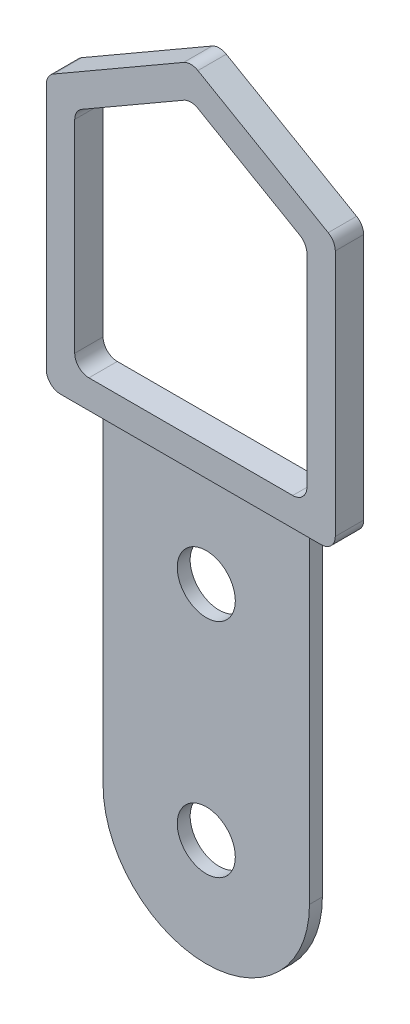
ISO-10303-21;
HEADER;
FILE_DESCRIPTION(('STEP AP214'),'2;1');
FILE_NAME('part.step','',(''),(''),'','','');
FILE_SCHEMA(('AUTOMOTIVE_DESIGN { 1 0 10303 214 1 1 1 1 }'));
ENDSEC;
DATA;
#1=APPLICATION_CONTEXT('core data for automotive mechanical design processes');
#2=APPLICATION_PROTOCOL_DEFINITION('international standard','automotive_design',2000,#1);
#3=PRODUCT_CONTEXT('',#1,'mechanical');
#4=PRODUCT('Part','Part','',(#3));
#5=PRODUCT_RELATED_PRODUCT_CATEGORY('part','',(#4));
#6=PRODUCT_DEFINITION_FORMATION('','',#4);
#7=PRODUCT_DEFINITION_CONTEXT('part definition',#1,'design');
#8=PRODUCT_DEFINITION('design','',#6,#7);
#9=PRODUCT_DEFINITION_SHAPE('','',#8);
#10=(LENGTH_UNIT() NAMED_UNIT(*) SI_UNIT(.MILLI.,.METRE.));
#11=(NAMED_UNIT(*) PLANE_ANGLE_UNIT() SI_UNIT($,.RADIAN.));
#12=(NAMED_UNIT(*) SI_UNIT($,.STERADIAN.) SOLID_ANGLE_UNIT());
#13=UNCERTAINTY_MEASURE_WITH_UNIT(LENGTH_MEASURE(1.E-05),#10,'distance_accuracy_value','');
#14=(GEOMETRIC_REPRESENTATION_CONTEXT(3) GLOBAL_UNCERTAINTY_ASSIGNED_CONTEXT((#13)) GLOBAL_UNIT_ASSIGNED_CONTEXT((#10,
#11,#12)) REPRESENTATION_CONTEXT('',''));
#15=CARTESIAN_POINT('',(0.,0.,0.));
#16=DIRECTION('',(0.,0.,1.));
#17=DIRECTION('',(1.,0.,0.));
#18=AXIS2_PLACEMENT_3D('',#15,#16,#17);
#19=CARTESIAN_POINT('',(8.,0.,2.2));
#20=DIRECTION('',(1.,0.,0.));
#21=DIRECTION('',(0.,1.,0.));
#22=AXIS2_PLACEMENT_3D('',#19,#20,#21);
#23=PLANE('',#22);
#24=DIRECTION('',(0.,-1.,0.));
#25=VECTOR('',#24,1.);
#26=CARTESIAN_POINT('',(8.,0.,0.));
#27=LINE('',#26,#25);
#28=CARTESIAN_POINT('',(8.,14.8,0.));
#29=VERTEX_POINT('',#28);
#30=CARTESIAN_POINT('',(8.,-10.,0.));
#31=VERTEX_POINT('',#30);
#32=EDGE_CURVE('E282',#29,#31,#27,.T.);
#33=ORIENTED_EDGE('',*,*,#32,.F.);
#34=DIRECTION('',(0.,0.,-1.));
#35=VECTOR('',#34,1.);
#36=CARTESIAN_POINT('',(8.,14.8,1.));
#37=LINE('',#36,#35);
#38=CARTESIAN_POINT('',(8.,14.8,1.));
#39=VERTEX_POINT('',#38);
#40=EDGE_CURVE('E483',#29,#39,#37,.F.);
#41=ORIENTED_EDGE('',*,*,#40,.T.);
#42=DIRECTION('',(0.,1.,0.));
#43=VECTOR('',#42,1.);
#44=CARTESIAN_POINT('',(8.,0.,1.));
#45=LINE('',#44,#43);
#46=CARTESIAN_POINT('',(8.,-10.,1.));
#47=VERTEX_POINT('',#46);
#48=EDGE_CURVE('E286',#47,#39,#45,.T.);
#49=ORIENTED_EDGE('',*,*,#48,.F.);
#50=DIRECTION('',(0.,0.,-1.));
#51=VECTOR('',#50,1.);
#52=CARTESIAN_POINT('',(8.,-10.,0.));
#53=LINE('',#52,#51);
#54=EDGE_CURVE('E449',#47,#31,#53,.T.);
#55=ORIENTED_EDGE('',*,*,#54,.T.);
#56=EDGE_LOOP('',(#33,#41,#49,#55));
#57=FACE_BOUND('',#56,.T.);
#58=ADVANCED_FACE('F40',(#57),#23,.T.);
#59=CARTESIAN_POINT('',(-8.,0.,2.2));
#60=DIRECTION('',(1.,0.,0.));
#61=DIRECTION('',(0.,1.,0.));
#62=AXIS2_PLACEMENT_3D('',#59,#60,#61);
#63=PLANE('',#62);
#64=DIRECTION('',(0.,-1.,0.));
#65=VECTOR('',#64,1.);
#66=CARTESIAN_POINT('',(-8.,0.,1.));
#67=LINE('',#66,#65);
#68=CARTESIAN_POINT('',(-8.,14.8,1.));
#69=VERTEX_POINT('',#68);
#70=CARTESIAN_POINT('',(-8.,-10.,1.));
#71=VERTEX_POINT('',#70);
#72=EDGE_CURVE('E509',#69,#71,#67,.T.);
#73=ORIENTED_EDGE('',*,*,#72,.F.);
#74=DIRECTION('',(0.,0.,-1.));
#75=VECTOR('',#74,1.);
#76=CARTESIAN_POINT('',(-8.,14.8,2.2));
#77=LINE('',#76,#75);
#78=CARTESIAN_POINT('',(-8.,14.8,0.));
#79=VERTEX_POINT('',#78);
#80=EDGE_CURVE('E486',#69,#79,#77,.T.);
#81=ORIENTED_EDGE('',*,*,#80,.T.);
#82=DIRECTION('',(0.,-1.,0.));
#83=VECTOR('',#82,1.);
#84=CARTESIAN_POINT('',(-8.,0.,0.));
#85=LINE('',#84,#83);
#86=CARTESIAN_POINT('',(-8.,-10.,0.));
#87=VERTEX_POINT('',#86);
#88=EDGE_CURVE('E309',#79,#87,#85,.T.);
#89=ORIENTED_EDGE('',*,*,#88,.T.);
#90=DIRECTION('',(0.,0.,-1.));
#91=VECTOR('',#90,1.);
#92=CARTESIAN_POINT('',(-8.,-10.,2.2));
#93=LINE('',#92,#91);
#94=EDGE_CURVE('E466',#87,#71,#93,.F.);
#95=ORIENTED_EDGE('',*,*,#94,.T.);
#96=EDGE_LOOP('',(#73,#81,#89,#95));
#97=FACE_BOUND('',#96,.T.);
#98=ADVANCED_FACE('F508',(#97),#63,.F.);
#99=CARTESIAN_POINT('',(0.,0.,2.2));
#100=DIRECTION('',(0.,0.,1.));
#101=DIRECTION('',(1.,0.,0.));
#102=AXIS2_PLACEMENT_3D('',#99,#100,#101);
#103=PLANE('',#102);
#104=DIRECTION('',(0.866025403784442,-0.499999999999994,0.));
#105=VECTOR('',#104,1.);
#106=CARTESIAN_POINT('',(17.5932322092839,30.4723720558374,2.2));
#107=LINE('',#106,#105);
#108=CARTESIAN_POINT('',(0.549999999999991,40.3122867597285,2.2));
#109=VERTEX_POINT('',#108);
#110=CARTESIAN_POINT('',(8.44999999999999,35.7512196331306,2.2));
#111=VERTEX_POINT('',#110);
#112=EDGE_CURVE('E278',#109,#111,#107,.T.);
#113=ORIENTED_EDGE('',*,*,#112,.T.);
#114=CARTESIAN_POINT('',(7.9,34.7985916889677,2.2));
#115=DIRECTION('',(0.,0.,1.));
#116=DIRECTION('',(1.,0.,0.));
#117=AXIS2_PLACEMENT_3D('',#114,#115,#116);
#118=CIRCLE('',#117,1.1);
#119=CARTESIAN_POINT('',(9.,34.7985916889677,2.2));
#120=VERTEX_POINT('',#119);
#121=EDGE_CURVE('E434',#111,#120,#118,.F.);
#122=ORIENTED_EDGE('',*,*,#121,.T.);
#123=DIRECTION('',(0.,-1.,0.));
#124=VECTOR('',#123,1.);
#125=CARTESIAN_POINT('',(9.,0.,2.2));
#126=LINE('',#125,#124);
#127=CARTESIAN_POINT('',(9.,19.1,2.2));
#128=VERTEX_POINT('',#127);
#129=EDGE_CURVE('E262',#120,#128,#126,.T.);
#130=ORIENTED_EDGE('',*,*,#129,.T.);
#131=CARTESIAN_POINT('',(7.9,19.1,2.2));
#132=DIRECTION('',(0.,0.,1.));
#133=DIRECTION('',(1.,0.,0.));
#134=AXIS2_PLACEMENT_3D('',#131,#132,#133);
#135=CIRCLE('',#134,1.1);
#136=CARTESIAN_POINT('',(7.9,18.,2.2));
#137=VERTEX_POINT('',#136);
#138=EDGE_CURVE('E422',#128,#137,#135,.F.);
#139=ORIENTED_EDGE('',*,*,#138,.T.);
#140=DIRECTION('',(1.,0.,0.));
#141=VECTOR('',#140,1.);
#142=CARTESIAN_POINT('',(0.,18.,2.2));
#143=LINE('',#142,#141);
#144=CARTESIAN_POINT('',(-7.9,18.,2.2));
#145=VERTEX_POINT('',#144);
#146=EDGE_CURVE('E266',#145,#137,#143,.T.);
#147=ORIENTED_EDGE('',*,*,#146,.F.);
#148=CARTESIAN_POINT('',(-7.9,19.1,2.2));
#149=DIRECTION('',(0.,0.,1.));
#150=DIRECTION('',(1.,0.,0.));
#151=AXIS2_PLACEMENT_3D('',#148,#149,#150);
#152=CIRCLE('',#151,1.1);
#153=CARTESIAN_POINT('',(-9.,19.1,2.2));
#154=VERTEX_POINT('',#153);
#155=EDGE_CURVE('E428',#145,#154,#152,.F.);
#156=ORIENTED_EDGE('',*,*,#155,.T.);
#157=DIRECTION('',(0.,-1.,0.));
#158=VECTOR('',#157,1.);
#159=CARTESIAN_POINT('',(-9.,0.,2.2));
#160=LINE('',#159,#158);
#161=CARTESIAN_POINT('',(-9.,34.7985916889677,2.2));
#162=VERTEX_POINT('',#161);
#163=EDGE_CURVE('E270',#162,#154,#160,.T.);
#164=ORIENTED_EDGE('',*,*,#163,.F.);
#165=CARTESIAN_POINT('',(-7.9,34.7985916889677,2.2));
#166=DIRECTION('',(0.,0.,1.));
#167=DIRECTION('',(1.,0.,0.));
#168=AXIS2_PLACEMENT_3D('',#165,#166,#167);
#169=CIRCLE('',#168,1.1);
#170=CARTESIAN_POINT('',(-8.44999999999999,35.7512196331306,2.2));
#171=VERTEX_POINT('',#170);
#172=EDGE_CURVE('E440',#162,#171,#169,.F.);
#173=ORIENTED_EDGE('',*,*,#172,.T.);
#174=DIRECTION('',(-0.866025403784442,-0.499999999999994,0.));
#175=VECTOR('',#174,1.);
#176=CARTESIAN_POINT('',(-17.5932322092839,30.4723720558374,2.2));
#177=LINE('',#176,#175);
#178=CARTESIAN_POINT('',(-0.549999999999991,40.3122867597285,2.2));
#179=VERTEX_POINT('',#178);
#180=EDGE_CURVE('E274',#179,#171,#177,.T.);
#181=ORIENTED_EDGE('',*,*,#180,.F.);
#182=CARTESIAN_POINT('',(0.,39.3596588155657,2.2));
#183=DIRECTION('',(0.,0.,1.));
#184=DIRECTION('',(1.,0.,0.));
#185=AXIS2_PLACEMENT_3D('',#182,#183,#184);
#186=CIRCLE('',#185,1.1);
#187=EDGE_CURVE('E446',#179,#109,#186,.F.);
#188=ORIENTED_EDGE('',*,*,#187,.T.);
#189=EDGE_LOOP('',(#113,#122,#130,#139,#147,#156,#164,#173,#181,#188));
#190=FACE_BOUND('',#189,.T.);
#191=DIRECTION('',(0.,-1.,0.));
#192=VECTOR('',#191,1.);
#193=CARTESIAN_POINT('',(-11.2,0.,2.2));
#194=LINE('',#193,#192);
#195=CARTESIAN_POINT('',(-11.2,36.0687622811849,2.2));
#196=VERTEX_POINT('',#195);
#197=CARTESIAN_POINT('',(-11.2,16.9,2.2));
#198=VERTEX_POINT('',#197);
#199=EDGE_CURVE('E259',#196,#198,#194,.T.);
#200=ORIENTED_EDGE('',*,*,#199,.T.);
#201=CARTESIAN_POINT('',(-10.1,16.9,2.2));
#202=DIRECTION('',(0.,0.,1.));
#203=DIRECTION('',(1.,0.,0.));
#204=AXIS2_PLACEMENT_3D('',#201,#202,#203);
#205=CIRCLE('',#204,1.1);
#206=CARTESIAN_POINT('',(-10.1,15.8,2.2));
#207=VERTEX_POINT('',#206);
#208=EDGE_CURVE('E368',#198,#207,#205,.T.);
#209=ORIENTED_EDGE('',*,*,#208,.T.);
#210=DIRECTION('',(1.,0.,0.));
#211=VECTOR('',#210,1.);
#212=CARTESIAN_POINT('',(0.,15.8,2.2));
#213=LINE('',#212,#211);
#214=CARTESIAN_POINT('',(10.1,15.8,2.2));
#215=VERTEX_POINT('',#214);
#216=EDGE_CURVE('E253',#207,#215,#213,.T.);
#217=ORIENTED_EDGE('',*,*,#216,.T.);
#218=CARTESIAN_POINT('',(10.1,16.9,2.2));
#219=DIRECTION('',(0.,0.,1.));
#220=DIRECTION('',(1.,0.,0.));
#221=AXIS2_PLACEMENT_3D('',#218,#219,#220);
#222=CIRCLE('',#221,1.1);
#223=CARTESIAN_POINT('',(11.2,16.9,2.2));
#224=VERTEX_POINT('',#223);
#225=EDGE_CURVE('E365',#215,#224,#222,.T.);
#226=ORIENTED_EDGE('',*,*,#225,.T.);
#227=DIRECTION('',(0.,-1.,0.));
#228=VECTOR('',#227,1.);
#229=CARTESIAN_POINT('',(11.2,0.,2.2));
#230=LINE('',#229,#228);
#231=CARTESIAN_POINT('',(11.2,36.0687622811849,2.2));
#232=VERTEX_POINT('',#231);
#233=EDGE_CURVE('E249',#232,#224,#230,.T.);
#234=ORIENTED_EDGE('',*,*,#233,.F.);
#235=CARTESIAN_POINT('',(10.1,36.0687622811849,2.2));
#236=DIRECTION('',(0.,0.,1.));
#237=DIRECTION('',(1.,0.,0.));
#238=AXIS2_PLACEMENT_3D('',#235,#236,#237);
#239=CIRCLE('',#238,1.1);
#240=CARTESIAN_POINT('',(10.65,37.0213902253478,2.2));
#241=VERTEX_POINT('',#240);
#242=EDGE_CURVE('E247',#232,#241,#239,.T.);
#243=ORIENTED_EDGE('',*,*,#242,.T.);
#244=DIRECTION('',(0.866025403784442,-0.499999999999995,0.));
#245=VECTOR('',#244,1.);
#246=CARTESIAN_POINT('',(18.6932322092839,32.3776279441631,2.2));
#247=LINE('',#246,#245);
#248=CARTESIAN_POINT('',(0.549999999999995,42.8526279441629,2.2));
#249=VERTEX_POINT('',#248);
#250=EDGE_CURVE('E223',#249,#241,#247,.T.);
#251=ORIENTED_EDGE('',*,*,#250,.F.);
#252=CARTESIAN_POINT('',(0.,41.9,2.2));
#253=DIRECTION('',(0.,0.,1.));
#254=DIRECTION('',(1.,0.,0.));
#255=AXIS2_PLACEMENT_3D('',#252,#253,#254);
#256=CIRCLE('',#255,1.1);
#257=CARTESIAN_POINT('',(-0.549999999999995,42.8526279441629,2.2));
#258=VERTEX_POINT('',#257);
#259=EDGE_CURVE('E234',#249,#258,#256,.T.);
#260=ORIENTED_EDGE('',*,*,#259,.T.);
#261=DIRECTION('',(-0.866025403784442,-0.499999999999995,0.));
#262=VECTOR('',#261,1.);
#263=CARTESIAN_POINT('',(-18.6932322092839,32.3776279441631,2.2));
#264=LINE('',#263,#262);
#265=CARTESIAN_POINT('',(-10.65,37.0213902253478,2.2));
#266=VERTEX_POINT('',#265);
#267=EDGE_CURVE('E241',#258,#266,#264,.T.);
#268=ORIENTED_EDGE('',*,*,#267,.T.);
#269=CARTESIAN_POINT('',(-10.1,36.0687622811849,2.2));
#270=DIRECTION('',(0.,0.,1.));
#271=DIRECTION('',(1.,0.,0.));
#272=AXIS2_PLACEMENT_3D('',#269,#270,#271);
#273=CIRCLE('',#272,1.1);
#274=EDGE_CURVE('E360',#266,#196,#273,.T.);
#275=ORIENTED_EDGE('',*,*,#274,.T.);
#276=EDGE_LOOP('',(#200,#209,#217,#226,#234,#243,#251,#260,#268,#275));
#277=FACE_BOUND('',#276,.T.);
#278=ADVANCED_FACE('F244',(#190,#277),#103,.T.);
#279=CARTESIAN_POINT('',(9.,0.,2.2));
#280=DIRECTION('',(1.,0.,0.));
#281=DIRECTION('',(0.,0.,-1.));
#282=AXIS2_PLACEMENT_3D('',#279,#280,#281);
#283=PLANE('',#282);
#284=DIRECTION('',(0.,-1.,0.));
#285=VECTOR('',#284,1.);
#286=CARTESIAN_POINT('',(9.,0.,0.));
#287=LINE('',#286,#285);
#288=CARTESIAN_POINT('',(9.,34.7985916889677,0.));
#289=VERTEX_POINT('',#288);
#290=CARTESIAN_POINT('',(9.,19.1,0.));
#291=VERTEX_POINT('',#290);
#292=EDGE_CURVE('E312',#289,#291,#287,.T.);
#293=ORIENTED_EDGE('',*,*,#292,.T.);
#294=DIRECTION('',(0.,0.,-1.));
#295=VECTOR('',#294,1.);
#296=CARTESIAN_POINT('',(9.,19.1,2.2));
#297=LINE('',#296,#295);
#298=EDGE_CURVE('E389',#291,#128,#297,.F.);
#299=ORIENTED_EDGE('',*,*,#298,.T.);
#300=ORIENTED_EDGE('',*,*,#129,.F.);
#301=DIRECTION('',(0.,0.,-1.));
#302=VECTOR('',#301,1.);
#303=CARTESIAN_POINT('',(9.,34.7985916889677,0.));
#304=LINE('',#303,#302);
#305=EDGE_CURVE('E385',#120,#289,#304,.T.);
#306=ORIENTED_EDGE('',*,*,#305,.T.);
#307=EDGE_LOOP('',(#293,#299,#300,#306));
#308=FACE_BOUND('',#307,.T.);
#309=ADVANCED_FACE('F610',(#308),#283,.F.);
#310=CARTESIAN_POINT('',(0.,18.,2.2));
#311=DIRECTION('',(0.,1.,0.));
#312=DIRECTION('',(0.,0.,1.));
#313=AXIS2_PLACEMENT_3D('',#310,#311,#312);
#314=PLANE('',#313);
#315=ORIENTED_EDGE('',*,*,#146,.T.);
#316=DIRECTION('',(0.,0.,-1.));
#317=VECTOR('',#316,1.);
#318=CARTESIAN_POINT('',(7.9,18.,2.2));
#319=LINE('',#318,#317);
#320=CARTESIAN_POINT('',(7.9,18.,0.));
#321=VERTEX_POINT('',#320);
#322=EDGE_CURVE('E381',#137,#321,#319,.T.);
#323=ORIENTED_EDGE('',*,*,#322,.T.);
#324=DIRECTION('',(1.,0.,0.));
#325=VECTOR('',#324,1.);
#326=CARTESIAN_POINT('',(0.,18.,0.));
#327=LINE('',#326,#325);
#328=CARTESIAN_POINT('',(-7.9,18.,0.));
#329=VERTEX_POINT('',#328);
#330=EDGE_CURVE('E316',#329,#321,#327,.T.);
#331=ORIENTED_EDGE('',*,*,#330,.F.);
#332=DIRECTION('',(0.,0.,-1.));
#333=VECTOR('',#332,1.);
#334=CARTESIAN_POINT('',(-7.9,18.,2.2));
#335=LINE('',#334,#333);
#336=EDGE_CURVE('E378',#329,#145,#335,.F.);
#337=ORIENTED_EDGE('',*,*,#336,.T.);
#338=EDGE_LOOP('',(#315,#323,#331,#337));
#339=FACE_BOUND('',#338,.T.);
#340=ADVANCED_FACE('F580',(#339),#314,.T.);
#341=CARTESIAN_POINT('',(-9.,0.,2.2));
#342=DIRECTION('',(1.,0.,0.));
#343=DIRECTION('',(0.,0.,-1.));
#344=AXIS2_PLACEMENT_3D('',#341,#342,#343);
#345=PLANE('',#344);
#346=ORIENTED_EDGE('',*,*,#163,.T.);
#347=DIRECTION('',(0.,0.,-1.));
#348=VECTOR('',#347,1.);
#349=CARTESIAN_POINT('',(-9.,19.1,0.));
#350=LINE('',#349,#348);
#351=CARTESIAN_POINT('',(-9.,19.1,0.));
#352=VERTEX_POINT('',#351);
#353=EDGE_CURVE('E395',#154,#352,#350,.T.);
#354=ORIENTED_EDGE('',*,*,#353,.T.);
#355=DIRECTION('',(0.,-1.,0.));
#356=VECTOR('',#355,1.);
#357=CARTESIAN_POINT('',(-9.,0.,0.));
#358=LINE('',#357,#356);
#359=CARTESIAN_POINT('',(-9.,34.7985916889677,0.));
#360=VERTEX_POINT('',#359);
#361=EDGE_CURVE('E320',#360,#352,#358,.T.);
#362=ORIENTED_EDGE('',*,*,#361,.F.);
#363=DIRECTION('',(0.,0.,-1.));
#364=VECTOR('',#363,1.);
#365=CARTESIAN_POINT('',(-9.,34.7985916889677,2.2));
#366=LINE('',#365,#364);
#367=EDGE_CURVE('E392',#360,#162,#366,.F.);
#368=ORIENTED_EDGE('',*,*,#367,.T.);
#369=EDGE_LOOP('',(#346,#354,#362,#368));
#370=FACE_BOUND('',#369,.T.);
#371=ADVANCED_FACE('F587',(#370),#345,.T.);
#372=CARTESIAN_POINT('',(-17.5932322092839,30.4723720558374,2.2));
#373=DIRECTION('',(0.499999999999994,-0.866025403784442,0.));
#374=DIRECTION('',(0.866025403784442,0.499999999999994,0.));
#375=AXIS2_PLACEMENT_3D('',#372,#373,#374);
#376=PLANE('',#375);
#377=ORIENTED_EDGE('',*,*,#180,.T.);
#378=DIRECTION('',(0.,0.,-1.));
#379=VECTOR('',#378,1.);
#380=CARTESIAN_POINT('',(-8.44999999999999,35.7512196331306,0.));
#381=LINE('',#380,#379);
#382=CARTESIAN_POINT('',(-8.44999999999999,35.7512196331306,0.));
#383=VERTEX_POINT('',#382);
#384=EDGE_CURVE('E415',#171,#383,#381,.T.);
#385=ORIENTED_EDGE('',*,*,#384,.T.);
#386=DIRECTION('',(-0.866025403784442,-0.499999999999994,0.));
#387=VECTOR('',#386,1.);
#388=CARTESIAN_POINT('',(-17.5932322092839,30.4723720558374,0.));
#389=LINE('',#388,#387);
#390=CARTESIAN_POINT('',(-0.549999999999991,40.3122867597285,0.));
#391=VERTEX_POINT('',#390);
#392=EDGE_CURVE('E324',#391,#383,#389,.T.);
#393=ORIENTED_EDGE('',*,*,#392,.F.);
#394=DIRECTION('',(0.,0.,-1.));
#395=VECTOR('',#394,1.);
#396=CARTESIAN_POINT('',(-0.549999999999991,40.3122867597285,2.2));
#397=LINE('',#396,#395);
#398=EDGE_CURVE('E412',#391,#179,#397,.F.);
#399=ORIENTED_EDGE('',*,*,#398,.T.);
#400=EDGE_LOOP('',(#377,#385,#393,#399));
#401=FACE_BOUND('',#400,.T.);
#402=ADVANCED_FACE('F596',(#401),#376,.T.);
#403=CARTESIAN_POINT('',(11.2,0.,2.2));
#404=DIRECTION('',(1.,0.,0.));
#405=DIRECTION('',(0.,1.,0.));
#406=AXIS2_PLACEMENT_3D('',#403,#404,#405);
#407=PLANE('',#406);
#408=ORIENTED_EDGE('',*,*,#233,.T.);
#409=DIRECTION('',(0.,0.,-1.));
#410=VECTOR('',#409,1.);
#411=CARTESIAN_POINT('',(11.2,16.9,2.2));
#412=LINE('',#411,#410);
#413=CARTESIAN_POINT('',(11.2,16.9,0.));
#414=VERTEX_POINT('',#413);
#415=EDGE_CURVE('E374',#224,#414,#412,.T.);
#416=ORIENTED_EDGE('',*,*,#415,.T.);
#417=DIRECTION('',(0.,-1.,0.));
#418=VECTOR('',#417,1.);
#419=CARTESIAN_POINT('',(11.2,0.,0.));
#420=LINE('',#419,#418);
#421=CARTESIAN_POINT('',(11.2,36.0687622811849,0.));
#422=VERTEX_POINT('',#421);
#423=EDGE_CURVE('E289',#422,#414,#420,.T.);
#424=ORIENTED_EDGE('',*,*,#423,.F.);
#425=DIRECTION('',(0.,0.,-1.));
#426=VECTOR('',#425,1.);
#427=CARTESIAN_POINT('',(11.2,36.0687622811849,2.2));
#428=LINE('',#427,#426);
#429=EDGE_CURVE('E371',#422,#232,#428,.F.);
#430=ORIENTED_EDGE('',*,*,#429,.T.);
#431=EDGE_LOOP('',(#408,#416,#424,#430));
#432=FACE_BOUND('',#431,.T.);
#433=ADVANCED_FACE('F532',(#432),#407,.T.);
#434=CARTESIAN_POINT('',(18.6932322092839,32.3776279441631,2.2));
#435=DIRECTION('',(0.499999999999995,0.866025403784442,0.));
#436=DIRECTION('',(-0.866025403784442,0.499999999999995,0.));
#437=AXIS2_PLACEMENT_3D('',#434,#435,#436);
#438=PLANE('',#437);
#439=ORIENTED_EDGE('',*,*,#250,.T.);
#440=DIRECTION('',(0.,0.,-1.));
#441=VECTOR('',#440,1.);
#442=CARTESIAN_POINT('',(10.65,37.0213902253478,2.2));
#443=LINE('',#442,#441);
#444=CARTESIAN_POINT('',(10.65,37.0213902253478,0.));
#445=VERTEX_POINT('',#444);
#446=EDGE_CURVE('E399',#241,#445,#443,.T.);
#447=ORIENTED_EDGE('',*,*,#446,.T.);
#448=DIRECTION('',(0.866025403784442,-0.499999999999995,0.));
#449=VECTOR('',#448,1.);
#450=CARTESIAN_POINT('',(18.6932322092839,32.3776279441631,0.));
#451=LINE('',#450,#449);
#452=CARTESIAN_POINT('',(0.549999999999995,42.8526279441629,0.));
#453=VERTEX_POINT('',#452);
#454=EDGE_CURVE('E226',#453,#445,#451,.T.);
#455=ORIENTED_EDGE('',*,*,#454,.F.);
#456=DIRECTION('',(0.,0.,-1.));
#457=VECTOR('',#456,1.);
#458=CARTESIAN_POINT('',(0.549999999999995,42.8526279441629,2.2));
#459=LINE('',#458,#457);
#460=EDGE_CURVE('E218',#249,#453,#459,.T.);
#461=ORIENTED_EDGE('',*,*,#460,.F.);
#462=EDGE_LOOP('',(#439,#447,#455,#461));
#463=FACE_BOUND('',#462,.T.);
#464=ADVANCED_FACE('F220',(#463),#438,.T.);
#465=CARTESIAN_POINT('',(0.,41.9,2.2));
#466=DIRECTION('',(0.,0.,-1.));
#467=DIRECTION('',(-1.,0.,0.));
#468=AXIS2_PLACEMENT_3D('',#465,#466,#467);
#469=CYLINDRICAL_SURFACE('',#468,1.1);
#470=CARTESIAN_POINT('',(0.,41.9,0.));
#471=DIRECTION('',(0.,0.,1.));
#472=DIRECTION('',(1.,0.,0.));
#473=AXIS2_PLACEMENT_3D('',#470,#471,#472);
#474=CIRCLE('',#473,1.1);
#475=CARTESIAN_POINT('',(-0.549999999999995,42.8526279441629,0.));
#476=VERTEX_POINT('',#475);
#477=EDGE_CURVE('E295',#453,#476,#474,.T.);
#478=ORIENTED_EDGE('',*,*,#477,.T.);
#479=DIRECTION('',(0.,0.,-1.));
#480=VECTOR('',#479,1.);
#481=CARTESIAN_POINT('',(-0.549999999999995,42.8526279441629,2.2));
#482=LINE('',#481,#480);
#483=EDGE_CURVE('E231',#258,#476,#482,.T.);
#484=ORIENTED_EDGE('',*,*,#483,.F.);
#485=ORIENTED_EDGE('',*,*,#259,.F.);
#486=ORIENTED_EDGE('',*,*,#460,.T.);
#487=EDGE_LOOP('',(#478,#484,#485,#486));
#488=FACE_BOUND('',#487,.T.);
#489=ADVANCED_FACE('F235',(#488),#469,.T.);
#490=CARTESIAN_POINT('',(-18.6932322092839,32.3776279441631,2.2));
#491=DIRECTION('',(0.499999999999995,-0.866025403784442,0.));
#492=DIRECTION('',(0.866025403784442,0.499999999999995,0.));
#493=AXIS2_PLACEMENT_3D('',#490,#491,#492);
#494=PLANE('',#493);
#495=DIRECTION('',(-0.866025403784442,-0.499999999999995,0.));
#496=VECTOR('',#495,1.);
#497=CARTESIAN_POINT('',(-18.6932322092839,32.3776279441631,0.));
#498=LINE('',#497,#496);
#499=CARTESIAN_POINT('',(-10.65,37.0213902253478,0.));
#500=VERTEX_POINT('',#499);
#501=EDGE_CURVE('E298',#476,#500,#498,.T.);
#502=ORIENTED_EDGE('',*,*,#501,.T.);
#503=DIRECTION('',(0.,0.,-1.));
#504=VECTOR('',#503,1.);
#505=CARTESIAN_POINT('',(-10.65,37.0213902253478,2.2));
#506=LINE('',#505,#504);
#507=EDGE_CURVE('E409',#500,#266,#506,.F.);
#508=ORIENTED_EDGE('',*,*,#507,.T.);
#509=ORIENTED_EDGE('',*,*,#267,.F.);
#510=ORIENTED_EDGE('',*,*,#483,.T.);
#511=EDGE_LOOP('',(#502,#508,#509,#510));
#512=FACE_BOUND('',#511,.T.);
#513=ADVANCED_FACE('F641',(#512),#494,.F.);
#514=CARTESIAN_POINT('',(-11.2,0.,2.2));
#515=DIRECTION('',(1.,0.,0.));
#516=DIRECTION('',(0.,1.,0.));
#517=AXIS2_PLACEMENT_3D('',#514,#515,#516);
#518=PLANE('',#517);
#519=DIRECTION('',(0.,-1.,0.));
#520=VECTOR('',#519,1.);
#521=CARTESIAN_POINT('',(-11.2,0.,0.));
#522=LINE('',#521,#520);
#523=CARTESIAN_POINT('',(-11.2,36.0687622811849,0.));
#524=VERTEX_POINT('',#523);
#525=CARTESIAN_POINT('',(-11.2,16.9,0.));
#526=VERTEX_POINT('',#525);
#527=EDGE_CURVE('E302',#524,#526,#522,.T.);
#528=ORIENTED_EDGE('',*,*,#527,.T.);
#529=DIRECTION('',(0.,0.,-1.));
#530=VECTOR('',#529,1.);
#531=CARTESIAN_POINT('',(-11.2,16.9,2.2));
#532=LINE('',#531,#530);
#533=EDGE_CURVE('E357',#526,#198,#532,.F.);
#534=ORIENTED_EDGE('',*,*,#533,.T.);
#535=ORIENTED_EDGE('',*,*,#199,.F.);
#536=DIRECTION('',(0.,0.,-1.));
#537=VECTOR('',#536,1.);
#538=CARTESIAN_POINT('',(-11.2,36.0687622811849,2.2));
#539=LINE('',#538,#537);
#540=EDGE_CURVE('E353',#196,#524,#539,.T.);
#541=ORIENTED_EDGE('',*,*,#540,.T.);
#542=EDGE_LOOP('',(#528,#534,#535,#541));
#543=FACE_BOUND('',#542,.T.);
#544=ADVANCED_FACE('F638',(#543),#518,.F.);
#545=CARTESIAN_POINT('',(0.,15.8,2.2));
#546=DIRECTION('',(0.,-1.,0.));
#547=DIRECTION('',(0.,0.,-1.));
#548=AXIS2_PLACEMENT_3D('',#545,#546,#547);
#549=PLANE('',#548);
#550=DIRECTION('',(1.,0.,0.));
#551=VECTOR('',#550,1.);
#552=CARTESIAN_POINT('',(0.,15.8,1.));
#553=LINE('',#552,#551);
#554=CARTESIAN_POINT('',(-9.,15.8,1.));
#555=VERTEX_POINT('',#554);
#556=CARTESIAN_POINT('',(9.,15.8,1.));
#557=VERTEX_POINT('',#556);
#558=EDGE_CURVE('E513',#555,#557,#553,.T.);
#559=ORIENTED_EDGE('',*,*,#558,.T.);
#560=DIRECTION('',(0.,0.,-1.));
#561=VECTOR('',#560,1.);
#562=CARTESIAN_POINT('',(9.,15.8,0.));
#563=LINE('',#562,#561);
#564=CARTESIAN_POINT('',(9.,15.8,0.));
#565=VERTEX_POINT('',#564);
#566=EDGE_CURVE('E479',#557,#565,#563,.T.);
#567=ORIENTED_EDGE('',*,*,#566,.T.);
#568=DIRECTION('',(1.,0.,0.));
#569=VECTOR('',#568,1.);
#570=CARTESIAN_POINT('',(0.,15.8,0.));
#571=LINE('',#570,#569);
#572=CARTESIAN_POINT('',(10.1,15.8,0.));
#573=VERTEX_POINT('',#572);
#574=EDGE_CURVE('E285',#565,#573,#571,.T.);
#575=ORIENTED_EDGE('',*,*,#574,.T.);
#576=DIRECTION('',(0.,0.,-1.));
#577=VECTOR('',#576,1.);
#578=CARTESIAN_POINT('',(10.1,15.8,2.2));
#579=LINE('',#578,#577);
#580=EDGE_CURVE('E230',#573,#215,#579,.F.);
#581=ORIENTED_EDGE('',*,*,#580,.T.);
#582=ORIENTED_EDGE('',*,*,#216,.F.);
#583=DIRECTION('',(0.,0.,-1.));
#584=VECTOR('',#583,1.);
#585=CARTESIAN_POINT('',(-10.1,15.8,0.));
#586=LINE('',#585,#584);
#587=CARTESIAN_POINT('',(-10.1,15.8,0.));
#588=VERTEX_POINT('',#587);
#589=EDGE_CURVE('E336',#207,#588,#586,.T.);
#590=ORIENTED_EDGE('',*,*,#589,.T.);
#591=DIRECTION('',(-1.,0.,0.));
#592=VECTOR('',#591,1.);
#593=CARTESIAN_POINT('',(0.,15.8,0.));
#594=LINE('',#593,#592);
#595=CARTESIAN_POINT('',(-9.,15.8,0.));
#596=VERTEX_POINT('',#595);
#597=EDGE_CURVE('E306',#596,#588,#594,.T.);
#598=ORIENTED_EDGE('',*,*,#597,.F.);
#599=DIRECTION('',(0.,0.,-1.));
#600=VECTOR('',#599,1.);
#601=CARTESIAN_POINT('',(-9.,15.8,2.2));
#602=LINE('',#601,#600);
#603=EDGE_CURVE('E470',#596,#555,#602,.F.);
#604=ORIENTED_EDGE('',*,*,#603,.T.);
#605=EDGE_LOOP('',(#559,#567,#575,#581,#582,#590,#598,#604));
#606=FACE_BOUND('',#605,.T.);
#607=ADVANCED_FACE('F504',(#606),#549,.T.);
#608=CARTESIAN_POINT('',(17.5932322092839,30.4723720558374,2.2));
#609=DIRECTION('',(0.499999999999994,0.866025403784442,0.));
#610=DIRECTION('',(-0.866025403784442,0.499999999999994,0.));
#611=AXIS2_PLACEMENT_3D('',#608,#609,#610);
#612=PLANE('',#611);
#613=DIRECTION('',(0.866025403784442,-0.499999999999994,0.));
#614=VECTOR('',#613,1.);
#615=CARTESIAN_POINT('',(17.5932322092839,30.4723720558374,0.));
#616=LINE('',#615,#614);
#617=CARTESIAN_POINT('',(0.549999999999991,40.3122867597285,0.));
#618=VERTEX_POINT('',#617);
#619=CARTESIAN_POINT('',(8.44999999999999,35.7512196331306,0.));
#620=VERTEX_POINT('',#619);
#621=EDGE_CURVE('E328',#618,#620,#616,.T.);
#622=ORIENTED_EDGE('',*,*,#621,.T.);
#623=DIRECTION('',(0.,0.,-1.));
#624=VECTOR('',#623,1.);
#625=CARTESIAN_POINT('',(8.44999999999999,35.7512196331306,2.2));
#626=LINE('',#625,#624);
#627=EDGE_CURVE('E406',#620,#111,#626,.F.);
#628=ORIENTED_EDGE('',*,*,#627,.T.);
#629=ORIENTED_EDGE('',*,*,#112,.F.);
#630=DIRECTION('',(0.,0.,-1.));
#631=VECTOR('',#630,1.);
#632=CARTESIAN_POINT('',(0.549999999999991,40.3122867597285,2.2));
#633=LINE('',#632,#631);
#634=EDGE_CURVE('E402',#109,#618,#633,.T.);
#635=ORIENTED_EDGE('',*,*,#634,.T.);
#636=EDGE_LOOP('',(#622,#628,#629,#635));
#637=FACE_BOUND('',#636,.T.);
#638=ADVANCED_FACE('F605',(#637),#612,.F.);
#639=CARTESIAN_POINT('',(0.,0.,0.));
#640=DIRECTION('',(0.,0.,1.));
#641=DIRECTION('',(1.,0.,0.));
#642=AXIS2_PLACEMENT_3D('',#639,#640,#641);
#643=PLANE('',#642);
#644=CARTESIAN_POINT('',(0.,7.49999999999999,0.));
#645=DIRECTION('',(0.,0.,1.));
#646=DIRECTION('',(1.,0.,0.));
#647=AXIS2_PLACEMENT_3D('',#644,#645,#646);
#648=CIRCLE('',#647,2.25);
#649=CARTESIAN_POINT('',(2.25,7.49999999999999,0.));
#650=VERTEX_POINT('',#649);
#651=EDGE_CURVE('E935',#650,#650,#648,.T.);
#652=ORIENTED_EDGE('',*,*,#651,.T.);
#653=EDGE_LOOP('',(#652));
#654=FACE_BOUND('',#653,.T.);
#655=CARTESIAN_POINT('',(0.,-9.7,0.));
#656=DIRECTION('',(0.,0.,1.));
#657=DIRECTION('',(1.,0.,0.));
#658=AXIS2_PLACEMENT_3D('',#655,#656,#657);
#659=CIRCLE('',#658,2.25);
#660=CARTESIAN_POINT('',(2.25,-9.7,0.));
#661=VERTEX_POINT('',#660);
#662=EDGE_CURVE('E519',#661,#661,#659,.T.);
#663=ORIENTED_EDGE('',*,*,#662,.T.);
#664=EDGE_LOOP('',(#663));
#665=FACE_BOUND('',#664,.T.);
#666=ORIENTED_EDGE('',*,*,#574,.F.);
#667=CARTESIAN_POINT('',(9.,14.8,0.));
#668=DIRECTION('',(0.,0.,1.));
#669=DIRECTION('',(1.,0.,0.));
#670=AXIS2_PLACEMENT_3D('',#667,#668,#669);
#671=CIRCLE('',#670,1.);
#672=EDGE_CURVE('E489',#565,#29,#671,.T.);
#673=ORIENTED_EDGE('',*,*,#672,.T.);
#674=ORIENTED_EDGE('',*,*,#32,.T.);
#675=CARTESIAN_POINT('',(0.,-10.,0.));
#676=DIRECTION('',(0.,0.,1.));
#677=DIRECTION('',(1.,0.,0.));
#678=AXIS2_PLACEMENT_3D('',#675,#676,#677);
#679=CIRCLE('',#678,8.);
#680=CARTESIAN_POINT('',(0.,-18.,0.));
#681=VERTEX_POINT('',#680);
#682=EDGE_CURVE('E457',#31,#681,#679,.F.);
#683=ORIENTED_EDGE('',*,*,#682,.T.);
#684=CARTESIAN_POINT('',(0.,-10.,0.));
#685=DIRECTION('',(0.,0.,1.));
#686=DIRECTION('',(1.,0.,0.));
#687=AXIS2_PLACEMENT_3D('',#684,#685,#686);
#688=CIRCLE('',#687,8.);
#689=EDGE_CURVE('E453',#681,#87,#688,.F.);
#690=ORIENTED_EDGE('',*,*,#689,.T.);
#691=ORIENTED_EDGE('',*,*,#88,.F.);
#692=CARTESIAN_POINT('',(-9.,14.8,0.));
#693=DIRECTION('',(0.,0.,1.));
#694=DIRECTION('',(1.,0.,0.));
#695=AXIS2_PLACEMENT_3D('',#692,#693,#694);
#696=CIRCLE('',#695,1.);
#697=EDGE_CURVE('E49',#79,#596,#696,.T.);
#698=ORIENTED_EDGE('',*,*,#697,.T.);
#699=ORIENTED_EDGE('',*,*,#597,.T.);
#700=CARTESIAN_POINT('',(-10.1,16.9,0.));
#701=DIRECTION('',(0.,0.,1.));
#702=DIRECTION('',(1.,0.,0.));
#703=AXIS2_PLACEMENT_3D('',#700,#701,#702);
#704=CIRCLE('',#703,1.1);
#705=EDGE_CURVE('E350',#588,#526,#704,.F.);
#706=ORIENTED_EDGE('',*,*,#705,.T.);
#707=ORIENTED_EDGE('',*,*,#527,.F.);
#708=CARTESIAN_POINT('',(-10.1,36.0687622811849,0.));
#709=DIRECTION('',(0.,0.,1.));
#710=DIRECTION('',(1.,0.,0.));
#711=AXIS2_PLACEMENT_3D('',#708,#709,#710);
#712=CIRCLE('',#711,1.1);
#713=EDGE_CURVE('E340',#524,#500,#712,.F.);
#714=ORIENTED_EDGE('',*,*,#713,.T.);
#715=ORIENTED_EDGE('',*,*,#501,.F.);
#716=ORIENTED_EDGE('',*,*,#477,.F.);
#717=ORIENTED_EDGE('',*,*,#454,.T.);
#718=CARTESIAN_POINT('',(10.1,36.0687622811849,0.));
#719=DIRECTION('',(0.,0.,1.));
#720=DIRECTION('',(1.,0.,0.));
#721=AXIS2_PLACEMENT_3D('',#718,#719,#720);
#722=CIRCLE('',#721,1.1);
#723=EDGE_CURVE('E343',#445,#422,#722,.F.);
#724=ORIENTED_EDGE('',*,*,#723,.T.);
#725=ORIENTED_EDGE('',*,*,#423,.T.);
#726=CARTESIAN_POINT('',(10.1,16.9,0.));
#727=DIRECTION('',(0.,0.,1.));
#728=DIRECTION('',(1.,0.,0.));
#729=AXIS2_PLACEMENT_3D('',#726,#727,#728);
#730=CIRCLE('',#729,1.1);
#731=EDGE_CURVE('E346',#414,#573,#730,.F.);
#732=ORIENTED_EDGE('',*,*,#731,.T.);
#733=EDGE_LOOP('',(#666,#673,#674,#683,#690,#691,#698,#699,#706,#707,#714,#715,#716,#717,#724,
#725,#732));
#734=FACE_BOUND('',#733,.T.);
#735=ORIENTED_EDGE('',*,*,#292,.F.);
#736=CARTESIAN_POINT('',(7.9,34.7985916889677,0.));
#737=DIRECTION('',(0.,0.,1.));
#738=DIRECTION('',(1.,0.,0.));
#739=AXIS2_PLACEMENT_3D('',#736,#737,#738);
#740=CIRCLE('',#739,1.1);
#741=EDGE_CURVE('E431',#289,#620,#740,.T.);
#742=ORIENTED_EDGE('',*,*,#741,.T.);
#743=ORIENTED_EDGE('',*,*,#621,.F.);
#744=CARTESIAN_POINT('',(0.,39.3596588155657,0.));
#745=DIRECTION('',(0.,0.,1.));
#746=DIRECTION('',(1.,0.,0.));
#747=AXIS2_PLACEMENT_3D('',#744,#745,#746);
#748=CIRCLE('',#747,1.1);
#749=EDGE_CURVE('E443',#618,#391,#748,.T.);
#750=ORIENTED_EDGE('',*,*,#749,.T.);
#751=ORIENTED_EDGE('',*,*,#392,.T.);
#752=CARTESIAN_POINT('',(-7.9,34.7985916889677,0.));
#753=DIRECTION('',(0.,0.,1.));
#754=DIRECTION('',(1.,0.,0.));
#755=AXIS2_PLACEMENT_3D('',#752,#753,#754);
#756=CIRCLE('',#755,1.1);
#757=EDGE_CURVE('E437',#383,#360,#756,.T.);
#758=ORIENTED_EDGE('',*,*,#757,.T.);
#759=ORIENTED_EDGE('',*,*,#361,.T.);
#760=CARTESIAN_POINT('',(-7.9,19.1,0.));
#761=DIRECTION('',(0.,0.,1.));
#762=DIRECTION('',(1.,0.,0.));
#763=AXIS2_PLACEMENT_3D('',#760,#761,#762);
#764=CIRCLE('',#763,1.1);
#765=EDGE_CURVE('E425',#352,#329,#764,.T.);
#766=ORIENTED_EDGE('',*,*,#765,.T.);
#767=ORIENTED_EDGE('',*,*,#330,.T.);
#768=CARTESIAN_POINT('',(7.9,19.1,0.));
#769=DIRECTION('',(0.,0.,1.));
#770=DIRECTION('',(1.,0.,0.));
#771=AXIS2_PLACEMENT_3D('',#768,#769,#770);
#772=CIRCLE('',#771,1.1);
#773=EDGE_CURVE('E419',#321,#291,#772,.T.);
#774=ORIENTED_EDGE('',*,*,#773,.T.);
#775=EDGE_LOOP('',(#735,#742,#743,#750,#751,#758,#759,#766,#767,#774));
#776=FACE_BOUND('',#775,.T.);
#777=ADVANCED_FACE('F500',(#654,#665,#734,#776),#643,.F.);
#778=CARTESIAN_POINT('',(0.,0.,1.));
#779=DIRECTION('',(0.,0.,1.));
#780=DIRECTION('',(1.,0.,0.));
#781=AXIS2_PLACEMENT_3D('',#778,#779,#780);
#782=PLANE('',#781);
#783=CARTESIAN_POINT('',(0.,7.49999999999999,1.));
#784=DIRECTION('',(0.,0.,1.));
#785=DIRECTION('',(1.,0.,0.));
#786=AXIS2_PLACEMENT_3D('',#783,#784,#785);
#787=CIRCLE('',#786,2.24999999999999);
#788=CARTESIAN_POINT('',(2.24999999999999,7.49999999999999,1.));
#789=VERTEX_POINT('',#788);
#790=EDGE_CURVE('E475',#789,#789,#787,.T.);
#791=ORIENTED_EDGE('',*,*,#790,.F.);
#792=EDGE_LOOP('',(#791));
#793=FACE_BOUND('',#792,.T.);
#794=CARTESIAN_POINT('',(0.,-9.7,1.));
#795=DIRECTION('',(0.,0.,1.));
#796=DIRECTION('',(1.,0.,0.));
#797=AXIS2_PLACEMENT_3D('',#794,#795,#796);
#798=CIRCLE('',#797,2.24999999999999);
#799=CARTESIAN_POINT('',(2.24999999999999,-9.7,1.));
#800=VERTEX_POINT('',#799);
#801=EDGE_CURVE('E932',#800,#800,#798,.T.);
#802=ORIENTED_EDGE('',*,*,#801,.F.);
#803=EDGE_LOOP('',(#802));
#804=FACE_BOUND('',#803,.T.);
#805=CARTESIAN_POINT('',(0.,-10.,1.));
#806=DIRECTION('',(0.,0.,1.));
#807=DIRECTION('',(1.,0.,0.));
#808=AXIS2_PLACEMENT_3D('',#805,#806,#807);
#809=CIRCLE('',#808,8.);
#810=CARTESIAN_POINT('',(0.,-18.,1.));
#811=VERTEX_POINT('',#810);
#812=EDGE_CURVE('E460',#71,#811,#809,.T.);
#813=ORIENTED_EDGE('',*,*,#812,.T.);
#814=CARTESIAN_POINT('',(0.,-10.,1.));
#815=DIRECTION('',(0.,0.,1.));
#816=DIRECTION('',(1.,0.,0.));
#817=AXIS2_PLACEMENT_3D('',#814,#815,#816);
#818=CIRCLE('',#817,8.);
#819=EDGE_CURVE('E463',#811,#47,#818,.T.);
#820=ORIENTED_EDGE('',*,*,#819,.T.);
#821=ORIENTED_EDGE('',*,*,#48,.T.);
#822=CARTESIAN_POINT('',(9.,14.8,1.));
#823=DIRECTION('',(0.,0.,1.));
#824=DIRECTION('',(1.,0.,0.));
#825=AXIS2_PLACEMENT_3D('',#822,#823,#824);
#826=CIRCLE('',#825,1.);
#827=EDGE_CURVE('E492',#39,#557,#826,.F.);
#828=ORIENTED_EDGE('',*,*,#827,.T.);
#829=ORIENTED_EDGE('',*,*,#558,.F.);
#830=CARTESIAN_POINT('',(-9.,14.8,1.));
#831=DIRECTION('',(0.,0.,1.));
#832=DIRECTION('',(1.,0.,0.));
#833=AXIS2_PLACEMENT_3D('',#830,#831,#832);
#834=CIRCLE('',#833,1.);
#835=EDGE_CURVE('E11',#555,#69,#834,.F.);
#836=ORIENTED_EDGE('',*,*,#835,.T.);
#837=ORIENTED_EDGE('',*,*,#72,.T.);
#838=EDGE_LOOP('',(#813,#820,#821,#828,#829,#836,#837));
#839=FACE_BOUND('',#838,.T.);
#840=ADVANCED_FACE('F613',(#793,#804,#839),#782,.T.);
#841=CARTESIAN_POINT('',(0.,-9.7,1.));
#842=DIRECTION('',(0.,0.,1.));
#843=DIRECTION('',(1.,0.,0.));
#844=AXIS2_PLACEMENT_3D('',#841,#842,#843);
#845=CYLINDRICAL_SURFACE('',#844,2.24999999999999);
#846=ORIENTED_EDGE('',*,*,#662,.F.);
#847=EDGE_LOOP('',(#846));
#848=FACE_BOUND('',#847,.T.);
#849=ORIENTED_EDGE('',*,*,#801,.T.);
#850=EDGE_LOOP('',(#849));
#851=FACE_BOUND('',#850,.T.);
#852=ADVANCED_FACE('F620',(#848,#851),#845,.F.);
#853=CARTESIAN_POINT('',(0.,7.49999999999999,1.));
#854=DIRECTION('',(0.,0.,1.));
#855=DIRECTION('',(1.,0.,0.));
#856=AXIS2_PLACEMENT_3D('',#853,#854,#855);
#857=CYLINDRICAL_SURFACE('',#856,2.24999999999999);
#858=ORIENTED_EDGE('',*,*,#651,.F.);
#859=EDGE_LOOP('',(#858));
#860=FACE_BOUND('',#859,.T.);
#861=ORIENTED_EDGE('',*,*,#790,.T.);
#862=EDGE_LOOP('',(#861));
#863=FACE_BOUND('',#862,.T.);
#864=ADVANCED_FACE('F564',(#860,#863),#857,.F.);
#865=CARTESIAN_POINT('',(-10.1,16.9,2.2));
#866=DIRECTION('',(0.,0.,1.));
#867=DIRECTION('',(1.,0.,0.));
#868=AXIS2_PLACEMENT_3D('',#865,#866,#867);
#869=CYLINDRICAL_SURFACE('',#868,1.1);
#870=ORIENTED_EDGE('',*,*,#208,.F.);
#871=ORIENTED_EDGE('',*,*,#533,.F.);
#872=ORIENTED_EDGE('',*,*,#705,.F.);
#873=ORIENTED_EDGE('',*,*,#589,.F.);
#874=EDGE_LOOP('',(#870,#871,#872,#873));
#875=FACE_BOUND('',#874,.T.);
#876=ADVANCED_FACE('F561',(#875),#869,.T.);
#877=CARTESIAN_POINT('',(10.1,16.9,2.2));
#878=DIRECTION('',(0.,0.,-1.));
#879=DIRECTION('',(-1.,0.,0.));
#880=AXIS2_PLACEMENT_3D('',#877,#878,#879);
#881=CYLINDRICAL_SURFACE('',#880,1.1);
#882=ORIENTED_EDGE('',*,*,#225,.F.);
#883=ORIENTED_EDGE('',*,*,#580,.F.);
#884=ORIENTED_EDGE('',*,*,#731,.F.);
#885=ORIENTED_EDGE('',*,*,#415,.F.);
#886=EDGE_LOOP('',(#882,#883,#884,#885));
#887=FACE_BOUND('',#886,.T.);
#888=ADVANCED_FACE('F529',(#887),#881,.T.);
#889=CARTESIAN_POINT('',(7.9,19.1,2.2));
#890=DIRECTION('',(0.,0.,-1.));
#891=DIRECTION('',(-1.,0.,0.));
#892=AXIS2_PLACEMENT_3D('',#889,#890,#891);
#893=CYLINDRICAL_SURFACE('',#892,1.1);
#894=ORIENTED_EDGE('',*,*,#138,.F.);
#895=ORIENTED_EDGE('',*,*,#298,.F.);
#896=ORIENTED_EDGE('',*,*,#773,.F.);
#897=ORIENTED_EDGE('',*,*,#322,.F.);
#898=EDGE_LOOP('',(#894,#895,#896,#897));
#899=FACE_BOUND('',#898,.T.);
#900=ADVANCED_FACE('F547',(#899),#893,.F.);
#901=CARTESIAN_POINT('',(-7.9,19.1,2.2));
#902=DIRECTION('',(0.,0.,1.));
#903=DIRECTION('',(1.,0.,0.));
#904=AXIS2_PLACEMENT_3D('',#901,#902,#903);
#905=CYLINDRICAL_SURFACE('',#904,1.1);
#906=ORIENTED_EDGE('',*,*,#155,.F.);
#907=ORIENTED_EDGE('',*,*,#336,.F.);
#908=ORIENTED_EDGE('',*,*,#765,.F.);
#909=ORIENTED_EDGE('',*,*,#353,.F.);
#910=EDGE_LOOP('',(#906,#907,#908,#909));
#911=FACE_BOUND('',#910,.T.);
#912=ADVANCED_FACE('F538',(#911),#905,.F.);
#913=CARTESIAN_POINT('',(10.1,36.0687622811849,2.2));
#914=DIRECTION('',(0.,0.,-1.));
#915=DIRECTION('',(-1.,0.,0.));
#916=AXIS2_PLACEMENT_3D('',#913,#914,#915);
#917=CYLINDRICAL_SURFACE('',#916,1.1);
#918=ORIENTED_EDGE('',*,*,#242,.F.);
#919=ORIENTED_EDGE('',*,*,#429,.F.);
#920=ORIENTED_EDGE('',*,*,#723,.F.);
#921=ORIENTED_EDGE('',*,*,#446,.F.);
#922=EDGE_LOOP('',(#918,#919,#920,#921));
#923=FACE_BOUND('',#922,.T.);
#924=ADVANCED_FACE('F535',(#923),#917,.T.);
#925=CARTESIAN_POINT('',(7.9,34.7985916889677,2.2));
#926=DIRECTION('',(0.,0.,1.));
#927=DIRECTION('',(1.,0.,0.));
#928=AXIS2_PLACEMENT_3D('',#925,#926,#927);
#929=CYLINDRICAL_SURFACE('',#928,1.1);
#930=ORIENTED_EDGE('',*,*,#121,.F.);
#931=ORIENTED_EDGE('',*,*,#627,.F.);
#932=ORIENTED_EDGE('',*,*,#741,.F.);
#933=ORIENTED_EDGE('',*,*,#305,.F.);
#934=EDGE_LOOP('',(#930,#931,#932,#933));
#935=FACE_BOUND('',#934,.T.);
#936=ADVANCED_FACE('F537',(#935),#929,.F.);
#937=CARTESIAN_POINT('',(-10.1,36.0687622811849,2.2));
#938=DIRECTION('',(0.,0.,-1.));
#939=DIRECTION('',(-1.,0.,0.));
#940=AXIS2_PLACEMENT_3D('',#937,#938,#939);
#941=CYLINDRICAL_SURFACE('',#940,1.1);
#942=ORIENTED_EDGE('',*,*,#274,.F.);
#943=ORIENTED_EDGE('',*,*,#507,.F.);
#944=ORIENTED_EDGE('',*,*,#713,.F.);
#945=ORIENTED_EDGE('',*,*,#540,.F.);
#946=EDGE_LOOP('',(#942,#943,#944,#945));
#947=FACE_BOUND('',#946,.T.);
#948=ADVANCED_FACE('F544',(#947),#941,.T.);
#949=CARTESIAN_POINT('',(-7.9,34.7985916889677,2.2));
#950=DIRECTION('',(0.,0.,1.));
#951=DIRECTION('',(1.,0.,0.));
#952=AXIS2_PLACEMENT_3D('',#949,#950,#951);
#953=CYLINDRICAL_SURFACE('',#952,1.1);
#954=ORIENTED_EDGE('',*,*,#172,.F.);
#955=ORIENTED_EDGE('',*,*,#367,.F.);
#956=ORIENTED_EDGE('',*,*,#757,.F.);
#957=ORIENTED_EDGE('',*,*,#384,.F.);
#958=EDGE_LOOP('',(#954,#955,#956,#957));
#959=FACE_BOUND('',#958,.T.);
#960=ADVANCED_FACE('F591',(#959),#953,.F.);
#961=CARTESIAN_POINT('',(0.,39.3596588155657,2.2));
#962=DIRECTION('',(0.,0.,-1.));
#963=DIRECTION('',(-1.,0.,0.));
#964=AXIS2_PLACEMENT_3D('',#961,#962,#963);
#965=CYLINDRICAL_SURFACE('',#964,1.1);
#966=ORIENTED_EDGE('',*,*,#187,.F.);
#967=ORIENTED_EDGE('',*,*,#398,.F.);
#968=ORIENTED_EDGE('',*,*,#749,.F.);
#969=ORIENTED_EDGE('',*,*,#634,.F.);
#970=EDGE_LOOP('',(#966,#967,#968,#969));
#971=FACE_BOUND('',#970,.T.);
#972=ADVANCED_FACE('F600',(#971),#965,.F.);
#973=CARTESIAN_POINT('',(0.,-10.,2.2));
#974=DIRECTION('',(0.,0.,-1.));
#975=DIRECTION('',(-1.,0.,0.));
#976=AXIS2_PLACEMENT_3D('',#973,#974,#975);
#977=CYLINDRICAL_SURFACE('',#976,8.);
#978=DIRECTION('',(0.,0.,-1.));
#979=VECTOR('',#978,1.);
#980=CARTESIAN_POINT('',(0.,-18.,2.2));
#981=LINE('',#980,#979);
#982=EDGE_CURVE('E471',#811,#681,#981,.T.);
#983=ORIENTED_EDGE('',*,*,#982,.F.);
#984=ORIENTED_EDGE('',*,*,#812,.F.);
#985=ORIENTED_EDGE('',*,*,#94,.F.);
#986=ORIENTED_EDGE('',*,*,#689,.F.);
#987=EDGE_LOOP('',(#983,#984,#985,#986));
#988=FACE_BOUND('',#987,.T.);
#989=ADVANCED_FACE('F735',(#988),#977,.T.);
#990=CARTESIAN_POINT('',(0.,-10.,2.2));
#991=DIRECTION('',(0.,0.,1.));
#992=DIRECTION('',(1.,0.,0.));
#993=AXIS2_PLACEMENT_3D('',#990,#991,#992);
#994=CYLINDRICAL_SURFACE('',#993,8.);
#995=ORIENTED_EDGE('',*,*,#819,.F.);
#996=ORIENTED_EDGE('',*,*,#982,.T.);
#997=ORIENTED_EDGE('',*,*,#682,.F.);
#998=ORIENTED_EDGE('',*,*,#54,.F.);
#999=EDGE_LOOP('',(#995,#996,#997,#998));
#1000=FACE_BOUND('',#999,.T.);
#1001=ADVANCED_FACE('F715',(#1000),#994,.T.);
#1002=CARTESIAN_POINT('',(9.,14.8,2.2));
#1003=DIRECTION('',(0.,0.,1.));
#1004=DIRECTION('',(1.,0.,0.));
#1005=AXIS2_PLACEMENT_3D('',#1002,#1003,#1004);
#1006=CYLINDRICAL_SURFACE('',#1005,1.);
#1007=ORIENTED_EDGE('',*,*,#827,.F.);
#1008=ORIENTED_EDGE('',*,*,#40,.F.);
#1009=ORIENTED_EDGE('',*,*,#672,.F.);
#1010=ORIENTED_EDGE('',*,*,#566,.F.);
#1011=EDGE_LOOP('',(#1007,#1008,#1009,#1010));
#1012=FACE_BOUND('',#1011,.T.);
#1013=ADVANCED_FACE('F710',(#1012),#1006,.F.);
#1014=CARTESIAN_POINT('',(-9.,14.8,2.2));
#1015=DIRECTION('',(0.,0.,-1.));
#1016=DIRECTION('',(-1.,0.,0.));
#1017=AXIS2_PLACEMENT_3D('',#1014,#1015,#1016);
#1018=CYLINDRICAL_SURFACE('',#1017,1.);
#1019=ORIENTED_EDGE('',*,*,#835,.F.);
#1020=ORIENTED_EDGE('',*,*,#603,.F.);
#1021=ORIENTED_EDGE('',*,*,#697,.F.);
#1022=ORIENTED_EDGE('',*,*,#80,.F.);
#1023=EDGE_LOOP('',(#1019,#1020,#1021,#1022));
#1024=FACE_BOUND('',#1023,.T.);
#1025=ADVANCED_FACE('F42',(#1024),#1018,.F.);
#1026=CLOSED_SHELL('',(#58,#98,#278,#309,#340,#371,#402,#433,#464,#489,#513,#544,#607,#638,#777,
#840,#852,#864,#876,#888,#900,#912,#924,#936,#948,#960,#972,#989,#1001,#1013,#1025));
#1027=MANIFOLD_SOLID_BREP('B2',#1026);
#1028=ADVANCED_BREP_SHAPE_REPRESENTATION('',(#18,#1027),#14);
#1029=SHAPE_DEFINITION_REPRESENTATION(#9,#1028);
ENDSEC;
END-ISO-10303-21;
